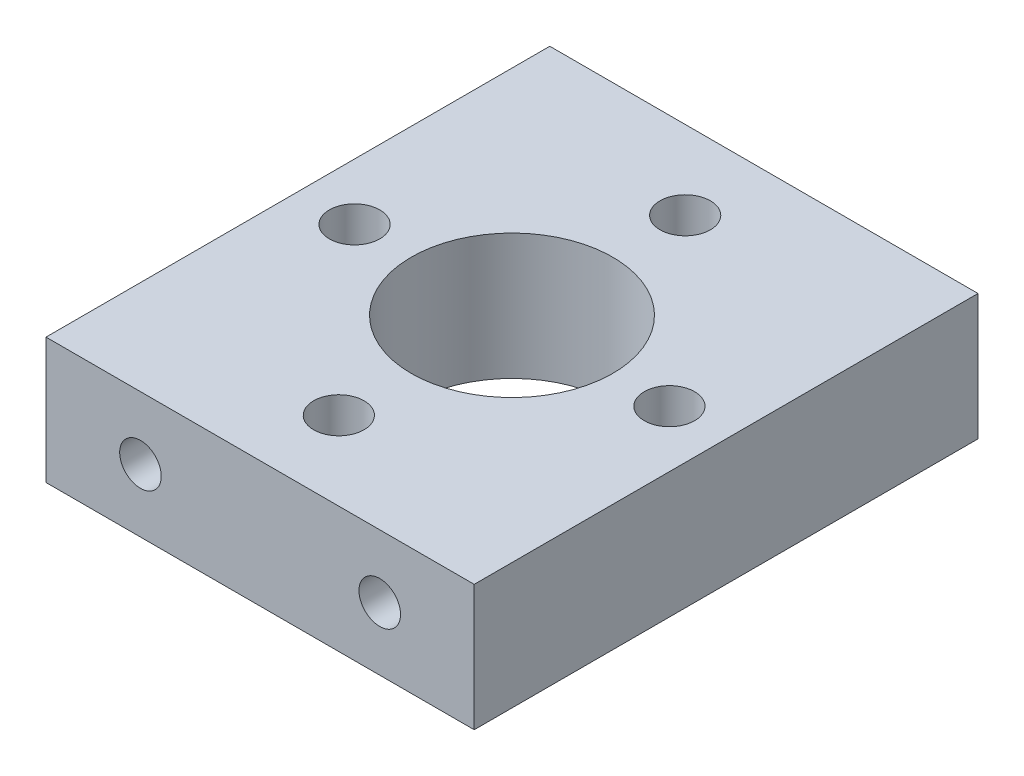
ISO-10303-21;
HEADER;
FILE_DESCRIPTION(('STEP AP214'),'2;1');
FILE_NAME('part.step','',(''),(''),'','','');
FILE_SCHEMA(('AUTOMOTIVE_DESIGN { 1 0 10303 214 1 1 1 1 }'));
ENDSEC;
DATA;
#1=APPLICATION_CONTEXT('core data for automotive mechanical design processes');
#2=APPLICATION_PROTOCOL_DEFINITION('international standard','automotive_design',2000,#1);
#3=PRODUCT_CONTEXT('',#1,'mechanical');
#4=PRODUCT('Part','Part','',(#3));
#5=PRODUCT_RELATED_PRODUCT_CATEGORY('part','',(#4));
#6=PRODUCT_DEFINITION_FORMATION('','',#4);
#7=PRODUCT_DEFINITION_CONTEXT('part definition',#1,'design');
#8=PRODUCT_DEFINITION('design','',#6,#7);
#9=PRODUCT_DEFINITION_SHAPE('','',#8);
#10=(LENGTH_UNIT() NAMED_UNIT(*) SI_UNIT(.MILLI.,.METRE.));
#11=(NAMED_UNIT(*) PLANE_ANGLE_UNIT() SI_UNIT($,.RADIAN.));
#12=(NAMED_UNIT(*) SI_UNIT($,.STERADIAN.) SOLID_ANGLE_UNIT());
#13=UNCERTAINTY_MEASURE_WITH_UNIT(LENGTH_MEASURE(1.E-05),#10,'distance_accuracy_value','');
#14=(GEOMETRIC_REPRESENTATION_CONTEXT(3) GLOBAL_UNCERTAINTY_ASSIGNED_CONTEXT((#13)) GLOBAL_UNIT_ASSIGNED_CONTEXT((#10,
#11,#12)) REPRESENTATION_CONTEXT('',''));
#15=CARTESIAN_POINT('',(0.,0.,0.));
#16=DIRECTION('',(0.,0.,1.));
#17=DIRECTION('',(1.,0.,0.));
#18=AXIS2_PLACEMENT_3D('',#15,#16,#17);
#19=CARTESIAN_POINT('',(0.,10.,0.));
#20=DIRECTION('',(0.,-1.,0.));
#21=DIRECTION('',(0.,0.,-1.));
#22=AXIS2_PLACEMENT_3D('',#19,#20,#21);
#23=PLANE('',#22);
#24=DIRECTION('',(0.,0.,-1.));
#25=VECTOR('',#24,1.);
#26=CARTESIAN_POINT('',(17.,10.,20.));
#27=LINE('',#26,#25);
#28=CARTESIAN_POINT('',(17.,10.,20.));
#29=VERTEX_POINT('',#28);
#30=CARTESIAN_POINT('',(17.,10.,-20.));
#31=VERTEX_POINT('',#30);
#32=EDGE_CURVE('E162',#29,#31,#27,.T.);
#33=ORIENTED_EDGE('',*,*,#32,.T.);
#34=DIRECTION('',(-1.,0.,0.));
#35=VECTOR('',#34,1.);
#36=CARTESIAN_POINT('',(-17.,10.,-20.));
#37=LINE('',#36,#35);
#38=CARTESIAN_POINT('',(-17.,10.,-20.));
#39=VERTEX_POINT('',#38);
#40=EDGE_CURVE('E85',#31,#39,#37,.T.);
#41=ORIENTED_EDGE('',*,*,#40,.T.);
#42=DIRECTION('',(0.,0.,1.));
#43=VECTOR('',#42,1.);
#44=CARTESIAN_POINT('',(-17.,10.,20.));
#45=LINE('',#44,#43);
#46=CARTESIAN_POINT('',(-17.,10.,20.));
#47=VERTEX_POINT('',#46);
#48=EDGE_CURVE('E165',#39,#47,#45,.T.);
#49=ORIENTED_EDGE('',*,*,#48,.T.);
#50=DIRECTION('',(1.,0.,0.));
#51=VECTOR('',#50,1.);
#52=CARTESIAN_POINT('',(-17.,10.,20.));
#53=LINE('',#52,#51);
#54=EDGE_CURVE('E54',#47,#29,#53,.T.);
#55=ORIENTED_EDGE('',*,*,#54,.T.);
#56=EDGE_LOOP('',(#33,#41,#49,#55));
#57=FACE_BOUND('',#56,.T.);
#58=CARTESIAN_POINT('',(0.,10.,0.));
#59=DIRECTION('',(0.,1.,0.));
#60=DIRECTION('',(0.,0.,1.));
#61=AXIS2_PLACEMENT_3D('',#58,#59,#60);
#62=CIRCLE('',#61,8.);
#63=CARTESIAN_POINT('',(0.,10.,8.));
#64=VERTEX_POINT('',#63);
#65=EDGE_CURVE('E156',#64,#64,#62,.T.);
#66=ORIENTED_EDGE('',*,*,#65,.F.);
#67=EDGE_LOOP('',(#66));
#68=FACE_BOUND('',#67,.T.);
#69=CARTESIAN_POINT('',(0.,10.,-13.75));
#70=DIRECTION('',(0.,1.,0.));
#71=DIRECTION('',(0.,0.,1.));
#72=AXIS2_PLACEMENT_3D('',#69,#70,#71);
#73=CIRCLE('',#72,2.);
#74=CARTESIAN_POINT('',(0.,10.,-11.75));
#75=VERTEX_POINT('',#74);
#76=EDGE_CURVE('E150',#75,#75,#73,.T.);
#77=ORIENTED_EDGE('',*,*,#76,.F.);
#78=EDGE_LOOP('',(#77));
#79=FACE_BOUND('',#78,.T.);
#80=CARTESIAN_POINT('',(-12.4999999999996,10.,0.));
#81=DIRECTION('',(0.,1.,0.));
#82=DIRECTION('',(0.,0.,1.));
#83=AXIS2_PLACEMENT_3D('',#80,#81,#82);
#84=CIRCLE('',#83,2.);
#85=CARTESIAN_POINT('',(-12.4999999999996,10.,2.));
#86=VERTEX_POINT('',#85);
#87=EDGE_CURVE('E144',#86,#86,#84,.T.);
#88=ORIENTED_EDGE('',*,*,#87,.F.);
#89=EDGE_LOOP('',(#88));
#90=FACE_BOUND('',#89,.T.);
#91=CARTESIAN_POINT('',(3.79037079500932E-13,10.,13.75));
#92=DIRECTION('',(0.,1.,0.));
#93=DIRECTION('',(0.,0.,1.));
#94=AXIS2_PLACEMENT_3D('',#91,#92,#93);
#95=CIRCLE('',#94,2.);
#96=CARTESIAN_POINT('',(3.79037079500932E-13,10.,15.75));
#97=VERTEX_POINT('',#96);
#98=EDGE_CURVE('E138',#97,#97,#95,.T.);
#99=ORIENTED_EDGE('',*,*,#98,.F.);
#100=EDGE_LOOP('',(#99));
#101=FACE_BOUND('',#100,.T.);
#102=CARTESIAN_POINT('',(12.5000000000004,10.,0.));
#103=DIRECTION('',(0.,1.,0.));
#104=DIRECTION('',(0.,0.,1.));
#105=AXIS2_PLACEMENT_3D('',#102,#103,#104);
#106=CIRCLE('',#105,2.);
#107=CARTESIAN_POINT('',(12.5000000000004,10.,2.));
#108=VERTEX_POINT('',#107);
#109=EDGE_CURVE('E132',#108,#108,#106,.T.);
#110=ORIENTED_EDGE('',*,*,#109,.F.);
#111=EDGE_LOOP('',(#110));
#112=FACE_BOUND('',#111,.T.);
#113=ADVANCED_FACE('F37',(#57,#68,#79,#90,#101,#112),#23,.F.);
#114=CARTESIAN_POINT('',(0.,0.,0.));
#115=DIRECTION('',(0.,-1.,0.));
#116=DIRECTION('',(0.,0.,-1.));
#117=AXIS2_PLACEMENT_3D('',#114,#115,#116);
#118=PLANE('',#117);
#119=CARTESIAN_POINT('',(3.79037079500932E-13,0.,13.75));
#120=DIRECTION('',(0.,1.,0.));
#121=DIRECTION('',(0.,0.,1.));
#122=AXIS2_PLACEMENT_3D('',#119,#120,#121);
#123=CIRCLE('',#122,2.);
#124=CARTESIAN_POINT('',(3.79037079500932E-13,0.,15.75));
#125=VERTEX_POINT('',#124);
#126=EDGE_CURVE('E135',#125,#125,#123,.T.);
#127=ORIENTED_EDGE('',*,*,#126,.T.);
#128=EDGE_LOOP('',(#127));
#129=FACE_BOUND('',#128,.T.);
#130=CARTESIAN_POINT('',(0.,0.,-13.75));
#131=DIRECTION('',(0.,1.,0.));
#132=DIRECTION('',(0.,0.,1.));
#133=AXIS2_PLACEMENT_3D('',#130,#131,#132);
#134=CIRCLE('',#133,2.);
#135=CARTESIAN_POINT('',(0.,0.,-11.75));
#136=VERTEX_POINT('',#135);
#137=EDGE_CURVE('E147',#136,#136,#134,.T.);
#138=ORIENTED_EDGE('',*,*,#137,.T.);
#139=EDGE_LOOP('',(#138));
#140=FACE_BOUND('',#139,.T.);
#141=DIRECTION('',(0.,0.,-1.));
#142=VECTOR('',#141,1.);
#143=CARTESIAN_POINT('',(17.,0.,20.));
#144=LINE('',#143,#142);
#145=CARTESIAN_POINT('',(17.,0.,20.));
#146=VERTEX_POINT('',#145);
#147=CARTESIAN_POINT('',(17.,0.,-20.));
#148=VERTEX_POINT('',#147);
#149=EDGE_CURVE('E159',#146,#148,#144,.T.);
#150=ORIENTED_EDGE('',*,*,#149,.F.);
#151=DIRECTION('',(1.,0.,0.));
#152=VECTOR('',#151,1.);
#153=CARTESIAN_POINT('',(-17.,0.,20.));
#154=LINE('',#153,#152);
#155=CARTESIAN_POINT('',(-17.,0.,20.));
#156=VERTEX_POINT('',#155);
#157=EDGE_CURVE('E78',#156,#146,#154,.T.);
#158=ORIENTED_EDGE('',*,*,#157,.F.);
#159=DIRECTION('',(0.,0.,1.));
#160=VECTOR('',#159,1.);
#161=CARTESIAN_POINT('',(-17.,0.,20.));
#162=LINE('',#161,#160);
#163=CARTESIAN_POINT('',(-17.,0.,-20.));
#164=VERTEX_POINT('',#163);
#165=EDGE_CURVE('E72',#164,#156,#162,.T.);
#166=ORIENTED_EDGE('',*,*,#165,.F.);
#167=DIRECTION('',(-1.,0.,0.));
#168=VECTOR('',#167,1.);
#169=CARTESIAN_POINT('',(-17.,0.,-20.));
#170=LINE('',#169,#168);
#171=EDGE_CURVE('E171',#148,#164,#170,.T.);
#172=ORIENTED_EDGE('',*,*,#171,.F.);
#173=EDGE_LOOP('',(#150,#158,#166,#172));
#174=FACE_BOUND('',#173,.T.);
#175=CARTESIAN_POINT('',(0.,0.,0.));
#176=DIRECTION('',(0.,1.,0.));
#177=DIRECTION('',(0.,0.,1.));
#178=AXIS2_PLACEMENT_3D('',#175,#176,#177);
#179=CIRCLE('',#178,8.);
#180=CARTESIAN_POINT('',(0.,0.,8.));
#181=VERTEX_POINT('',#180);
#182=EDGE_CURVE('E153',#181,#181,#179,.T.);
#183=ORIENTED_EDGE('',*,*,#182,.T.);
#184=EDGE_LOOP('',(#183));
#185=FACE_BOUND('',#184,.T.);
#186=CARTESIAN_POINT('',(-12.4999999999996,0.,0.));
#187=DIRECTION('',(0.,1.,0.));
#188=DIRECTION('',(0.,0.,1.));
#189=AXIS2_PLACEMENT_3D('',#186,#187,#188);
#190=CIRCLE('',#189,2.);
#191=CARTESIAN_POINT('',(-12.4999999999996,0.,2.));
#192=VERTEX_POINT('',#191);
#193=EDGE_CURVE('E141',#192,#192,#190,.T.);
#194=ORIENTED_EDGE('',*,*,#193,.T.);
#195=EDGE_LOOP('',(#194));
#196=FACE_BOUND('',#195,.T.);
#197=CARTESIAN_POINT('',(12.5000000000004,0.,0.));
#198=DIRECTION('',(0.,1.,0.));
#199=DIRECTION('',(0.,0.,1.));
#200=AXIS2_PLACEMENT_3D('',#197,#198,#199);
#201=CIRCLE('',#200,2.);
#202=CARTESIAN_POINT('',(12.5000000000004,0.,2.));
#203=VERTEX_POINT('',#202);
#204=EDGE_CURVE('E131',#203,#203,#201,.T.);
#205=ORIENTED_EDGE('',*,*,#204,.T.);
#206=EDGE_LOOP('',(#205));
#207=FACE_BOUND('',#206,.T.);
#208=ADVANCED_FACE('F181',(#129,#140,#174,#185,#196,#207),#118,.T.);
#209=CARTESIAN_POINT('',(17.,10.,20.));
#210=DIRECTION('',(-1.,0.,0.));
#211=DIRECTION('',(0.,0.,1.));
#212=AXIS2_PLACEMENT_3D('',#209,#210,#211);
#213=PLANE('',#212);
#214=ORIENTED_EDGE('',*,*,#149,.T.);
#215=DIRECTION('',(0.,-1.,0.));
#216=VECTOR('',#215,1.);
#217=CARTESIAN_POINT('',(17.,10.,-20.));
#218=LINE('',#217,#216);
#219=EDGE_CURVE('E11',#31,#148,#218,.T.);
#220=ORIENTED_EDGE('',*,*,#219,.F.);
#221=ORIENTED_EDGE('',*,*,#32,.F.);
#222=DIRECTION('',(0.,-1.,0.));
#223=VECTOR('',#222,1.);
#224=CARTESIAN_POINT('',(17.,10.,20.));
#225=LINE('',#224,#223);
#226=EDGE_CURVE('E168',#29,#146,#225,.T.);
#227=ORIENTED_EDGE('',*,*,#226,.T.);
#228=EDGE_LOOP('',(#214,#220,#221,#227));
#229=FACE_BOUND('',#228,.T.);
#230=ADVANCED_FACE('F39',(#229),#213,.F.);
#231=CARTESIAN_POINT('',(-17.,10.,-20.));
#232=DIRECTION('',(0.,0.,1.));
#233=DIRECTION('',(1.,0.,0.));
#234=AXIS2_PLACEMENT_3D('',#231,#232,#233);
#235=PLANE('',#234);
#236=CARTESIAN_POINT('',(9.5,5.,-20.));
#237=DIRECTION('',(0.,0.,-1.));
#238=DIRECTION('',(-1.,0.,0.));
#239=AXIS2_PLACEMENT_3D('',#236,#237,#238);
#240=CIRCLE('',#239,1.64999999999999);
#241=CARTESIAN_POINT('',(7.85000000000001,5.,-20.));
#242=VERTEX_POINT('',#241);
#243=EDGE_CURVE('E109',#242,#242,#240,.T.);
#244=ORIENTED_EDGE('',*,*,#243,.F.);
#245=EDGE_LOOP('',(#244));
#246=FACE_BOUND('',#245,.T.);
#247=CARTESIAN_POINT('',(-9.50000000000001,5.,-20.));
#248=DIRECTION('',(0.,0.,-1.));
#249=DIRECTION('',(-1.,0.,0.));
#250=AXIS2_PLACEMENT_3D('',#247,#248,#249);
#251=CIRCLE('',#250,1.64999999999999);
#252=CARTESIAN_POINT('',(-11.15,5.,-20.));
#253=VERTEX_POINT('',#252);
#254=EDGE_CURVE('E108',#253,#253,#251,.T.);
#255=ORIENTED_EDGE('',*,*,#254,.F.);
#256=EDGE_LOOP('',(#255));
#257=FACE_BOUND('',#256,.T.);
#258=ORIENTED_EDGE('',*,*,#171,.T.);
#259=DIRECTION('',(0.,-1.,0.));
#260=VECTOR('',#259,1.);
#261=CARTESIAN_POINT('',(-17.,10.,-20.));
#262=LINE('',#261,#260);
#263=EDGE_CURVE('E46',#39,#164,#262,.T.);
#264=ORIENTED_EDGE('',*,*,#263,.F.);
#265=ORIENTED_EDGE('',*,*,#40,.F.);
#266=ORIENTED_EDGE('',*,*,#219,.T.);
#267=EDGE_LOOP('',(#258,#264,#265,#266));
#268=FACE_BOUND('',#267,.T.);
#269=ADVANCED_FACE('F198',(#246,#257,#268),#235,.F.);
#270=CARTESIAN_POINT('',(-17.,10.,20.));
#271=DIRECTION('',(1.,0.,0.));
#272=DIRECTION('',(0.,0.,-1.));
#273=AXIS2_PLACEMENT_3D('',#270,#271,#272);
#274=PLANE('',#273);
#275=ORIENTED_EDGE('',*,*,#165,.T.);
#276=DIRECTION('',(0.,-1.,0.));
#277=VECTOR('',#276,1.);
#278=CARTESIAN_POINT('',(-17.,10.,20.));
#279=LINE('',#278,#277);
#280=EDGE_CURVE('E176',#47,#156,#279,.T.);
#281=ORIENTED_EDGE('',*,*,#280,.F.);
#282=ORIENTED_EDGE('',*,*,#48,.F.);
#283=ORIENTED_EDGE('',*,*,#263,.T.);
#284=EDGE_LOOP('',(#275,#281,#282,#283));
#285=FACE_BOUND('',#284,.T.);
#286=ADVANCED_FACE('F178',(#285),#274,.F.);
#287=CARTESIAN_POINT('',(-17.,10.,20.));
#288=DIRECTION('',(0.,0.,-1.));
#289=DIRECTION('',(-1.,0.,0.));
#290=AXIS2_PLACEMENT_3D('',#287,#288,#289);
#291=PLANE('',#290);
#292=CARTESIAN_POINT('',(-9.50000000000001,5.,20.));
#293=DIRECTION('',(0.,0.,1.));
#294=DIRECTION('',(1.,0.,0.));
#295=AXIS2_PLACEMENT_3D('',#292,#293,#294);
#296=CIRCLE('',#295,1.64999999999999);
#297=CARTESIAN_POINT('',(-7.85000000000001,5.,20.));
#298=VERTEX_POINT('',#297);
#299=EDGE_CURVE('E119',#298,#298,#296,.T.);
#300=ORIENTED_EDGE('',*,*,#299,.F.);
#301=EDGE_LOOP('',(#300));
#302=FACE_BOUND('',#301,.T.);
#303=CARTESIAN_POINT('',(9.5,5.,20.));
#304=DIRECTION('',(0.,0.,1.));
#305=DIRECTION('',(1.,0.,0.));
#306=AXIS2_PLACEMENT_3D('',#303,#304,#305);
#307=CIRCLE('',#306,1.64999999999999);
#308=CARTESIAN_POINT('',(11.15,5.,20.));
#309=VERTEX_POINT('',#308);
#310=EDGE_CURVE('E125',#309,#309,#307,.T.);
#311=ORIENTED_EDGE('',*,*,#310,.F.);
#312=EDGE_LOOP('',(#311));
#313=FACE_BOUND('',#312,.T.);
#314=ORIENTED_EDGE('',*,*,#157,.T.);
#315=ORIENTED_EDGE('',*,*,#226,.F.);
#316=ORIENTED_EDGE('',*,*,#54,.F.);
#317=ORIENTED_EDGE('',*,*,#280,.T.);
#318=EDGE_LOOP('',(#314,#315,#316,#317));
#319=FACE_BOUND('',#318,.T.);
#320=ADVANCED_FACE('F186',(#302,#313,#319),#291,.F.);
#321=CARTESIAN_POINT('',(0.,10.,0.));
#322=DIRECTION('',(0.,-1.,0.));
#323=DIRECTION('',(0.,0.,-1.));
#324=AXIS2_PLACEMENT_3D('',#321,#322,#323);
#325=CYLINDRICAL_SURFACE('',#324,8.);
#326=ORIENTED_EDGE('',*,*,#65,.T.);
#327=EDGE_LOOP('',(#326));
#328=FACE_BOUND('',#327,.T.);
#329=ORIENTED_EDGE('',*,*,#182,.F.);
#330=EDGE_LOOP('',(#329));
#331=FACE_BOUND('',#330,.T.);
#332=ADVANCED_FACE('F188',(#328,#331),#325,.F.);
#333=CARTESIAN_POINT('',(0.,10.,-13.75));
#334=DIRECTION('',(0.,-1.,0.));
#335=DIRECTION('',(0.,0.,-1.));
#336=AXIS2_PLACEMENT_3D('',#333,#334,#335);
#337=CYLINDRICAL_SURFACE('',#336,2.);
#338=ORIENTED_EDGE('',*,*,#76,.T.);
#339=EDGE_LOOP('',(#338));
#340=FACE_BOUND('',#339,.T.);
#341=ORIENTED_EDGE('',*,*,#137,.F.);
#342=EDGE_LOOP('',(#341));
#343=FACE_BOUND('',#342,.T.);
#344=ADVANCED_FACE('F195',(#340,#343),#337,.F.);
#345=CARTESIAN_POINT('',(-12.4999999999996,10.,0.));
#346=DIRECTION('',(0.,-1.,0.));
#347=DIRECTION('',(0.,0.,-1.));
#348=AXIS2_PLACEMENT_3D('',#345,#346,#347);
#349=CYLINDRICAL_SURFACE('',#348,2.);
#350=ORIENTED_EDGE('',*,*,#87,.T.);
#351=EDGE_LOOP('',(#350));
#352=FACE_BOUND('',#351,.T.);
#353=ORIENTED_EDGE('',*,*,#193,.F.);
#354=EDGE_LOOP('',(#353));
#355=FACE_BOUND('',#354,.T.);
#356=ADVANCED_FACE('F213',(#352,#355),#349,.F.);
#357=CARTESIAN_POINT('',(3.79037079500932E-13,10.,13.75));
#358=DIRECTION('',(0.,-1.,0.));
#359=DIRECTION('',(0.,0.,-1.));
#360=AXIS2_PLACEMENT_3D('',#357,#358,#359);
#361=CYLINDRICAL_SURFACE('',#360,2.);
#362=ORIENTED_EDGE('',*,*,#98,.T.);
#363=EDGE_LOOP('',(#362));
#364=FACE_BOUND('',#363,.T.);
#365=ORIENTED_EDGE('',*,*,#126,.F.);
#366=EDGE_LOOP('',(#365));
#367=FACE_BOUND('',#366,.T.);
#368=ADVANCED_FACE('F217',(#364,#367),#361,.F.);
#369=CARTESIAN_POINT('',(12.5000000000004,10.,0.));
#370=DIRECTION('',(0.,-1.,0.));
#371=DIRECTION('',(0.,0.,-1.));
#372=AXIS2_PLACEMENT_3D('',#369,#370,#371);
#373=CYLINDRICAL_SURFACE('',#372,2.);
#374=ORIENTED_EDGE('',*,*,#109,.T.);
#375=EDGE_LOOP('',(#374));
#376=FACE_BOUND('',#375,.T.);
#377=ORIENTED_EDGE('',*,*,#204,.F.);
#378=EDGE_LOOP('',(#377));
#379=FACE_BOUND('',#378,.T.);
#380=ADVANCED_FACE('F221',(#376,#379),#373,.F.);
#381=CARTESIAN_POINT('',(9.5,5.,5.));
#382=DIRECTION('',(0.,0.,1.));
#383=DIRECTION('',(1.,0.,0.));
#384=AXIS2_PLACEMENT_3D('',#381,#382,#383);
#385=CONICAL_SURFACE('',#384,1.65,1.02974425867665);
#386=CARTESIAN_POINT('',(9.49999999999999,5.,4.00857997860452));
#387=VERTEX_POINT('',#386);
#388=VERTEX_LOOP('',#387);
#389=FACE_BOUND('',#388,.T.);
#390=CARTESIAN_POINT('',(9.5,5.,5.));
#391=DIRECTION('',(0.,0.,1.));
#392=DIRECTION('',(1.,0.,0.));
#393=AXIS2_PLACEMENT_3D('',#390,#391,#392);
#394=CIRCLE('',#393,1.65);
#395=CARTESIAN_POINT('',(11.15,5.,5.));
#396=VERTEX_POINT('',#395);
#397=EDGE_CURVE('E128',#396,#396,#394,.T.);
#398=ORIENTED_EDGE('',*,*,#397,.T.);
#399=EDGE_LOOP('',(#398));
#400=FACE_BOUND('',#399,.T.);
#401=ADVANCED_FACE('F225',(#389,#400),#385,.F.);
#402=CARTESIAN_POINT('',(9.5,5.,20.));
#403=DIRECTION('',(0.,0.,1.));
#404=DIRECTION('',(1.,0.,0.));
#405=AXIS2_PLACEMENT_3D('',#402,#403,#404);
#406=CYLINDRICAL_SURFACE('',#405,1.64999999999999);
#407=ORIENTED_EDGE('',*,*,#397,.F.);
#408=EDGE_LOOP('',(#407));
#409=FACE_BOUND('',#408,.T.);
#410=ORIENTED_EDGE('',*,*,#310,.T.);
#411=EDGE_LOOP('',(#410));
#412=FACE_BOUND('',#411,.T.);
#413=ADVANCED_FACE('F229',(#409,#412),#406,.F.);
#414=CARTESIAN_POINT('',(-9.50000000000001,5.,5.));
#415=DIRECTION('',(0.,0.,1.));
#416=DIRECTION('',(1.,0.,0.));
#417=AXIS2_PLACEMENT_3D('',#414,#415,#416);
#418=CONICAL_SURFACE('',#417,1.65,1.02974425867665);
#419=CARTESIAN_POINT('',(-9.50000000000001,5.,4.00857997860452));
#420=VERTEX_POINT('',#419);
#421=VERTEX_LOOP('',#420);
#422=FACE_BOUND('',#421,.T.);
#423=CARTESIAN_POINT('',(-9.50000000000001,5.,5.));
#424=DIRECTION('',(0.,0.,1.));
#425=DIRECTION('',(1.,0.,0.));
#426=AXIS2_PLACEMENT_3D('',#423,#424,#425);
#427=CIRCLE('',#426,1.65);
#428=CARTESIAN_POINT('',(-7.85000000000001,5.,5.));
#429=VERTEX_POINT('',#428);
#430=EDGE_CURVE('E122',#429,#429,#427,.T.);
#431=ORIENTED_EDGE('',*,*,#430,.T.);
#432=EDGE_LOOP('',(#431));
#433=FACE_BOUND('',#432,.T.);
#434=ADVANCED_FACE('F233',(#422,#433),#418,.F.);
#435=CARTESIAN_POINT('',(-9.50000000000001,5.,20.));
#436=DIRECTION('',(0.,0.,1.));
#437=DIRECTION('',(1.,0.,0.));
#438=AXIS2_PLACEMENT_3D('',#435,#436,#437);
#439=CYLINDRICAL_SURFACE('',#438,1.64999999999999);
#440=ORIENTED_EDGE('',*,*,#430,.F.);
#441=EDGE_LOOP('',(#440));
#442=FACE_BOUND('',#441,.T.);
#443=ORIENTED_EDGE('',*,*,#299,.T.);
#444=EDGE_LOOP('',(#443));
#445=FACE_BOUND('',#444,.T.);
#446=ADVANCED_FACE('F237',(#442,#445),#439,.F.);
#447=CARTESIAN_POINT('',(-9.50000000000001,5.,-5.));
#448=DIRECTION('',(0.,0.,-1.));
#449=DIRECTION('',(-1.,0.,0.));
#450=AXIS2_PLACEMENT_3D('',#447,#448,#449);
#451=CONICAL_SURFACE('',#450,1.65,1.02974425867665);
#452=CARTESIAN_POINT('',(-9.50000000000001,5.,-4.00857997860453));
#453=VERTEX_POINT('',#452);
#454=VERTEX_LOOP('',#453);
#455=FACE_BOUND('',#454,.T.);
#456=CARTESIAN_POINT('',(-9.50000000000001,5.,-5.));
#457=DIRECTION('',(0.,0.,-1.));
#458=DIRECTION('',(-1.,0.,0.));
#459=AXIS2_PLACEMENT_3D('',#456,#457,#458);
#460=CIRCLE('',#459,1.65);
#461=CARTESIAN_POINT('',(-11.15,5.,-5.));
#462=VERTEX_POINT('',#461);
#463=EDGE_CURVE('E112',#462,#462,#460,.T.);
#464=ORIENTED_EDGE('',*,*,#463,.T.);
#465=EDGE_LOOP('',(#464));
#466=FACE_BOUND('',#465,.T.);
#467=ADVANCED_FACE('F241',(#455,#466),#451,.F.);
#468=CARTESIAN_POINT('',(-9.50000000000001,5.,-20.));
#469=DIRECTION('',(0.,0.,-1.));
#470=DIRECTION('',(-1.,0.,0.));
#471=AXIS2_PLACEMENT_3D('',#468,#469,#470);
#472=CYLINDRICAL_SURFACE('',#471,1.64999999999999);
#473=ORIENTED_EDGE('',*,*,#463,.F.);
#474=EDGE_LOOP('',(#473));
#475=FACE_BOUND('',#474,.T.);
#476=ORIENTED_EDGE('',*,*,#254,.T.);
#477=EDGE_LOOP('',(#476));
#478=FACE_BOUND('',#477,.T.);
#479=ADVANCED_FACE('F102',(#475,#478),#472,.F.);
#480=CARTESIAN_POINT('',(9.5,5.,-5.));
#481=DIRECTION('',(0.,0.,-1.));
#482=DIRECTION('',(-1.,0.,0.));
#483=AXIS2_PLACEMENT_3D('',#480,#481,#482);
#484=CONICAL_SURFACE('',#483,1.65,1.02974425867665);
#485=CARTESIAN_POINT('',(9.49999999999999,5.,-4.00857997860453));
#486=VERTEX_POINT('',#485);
#487=VERTEX_LOOP('',#486);
#488=FACE_BOUND('',#487,.T.);
#489=CARTESIAN_POINT('',(9.5,5.,-5.));
#490=DIRECTION('',(0.,0.,-1.));
#491=DIRECTION('',(-1.,0.,0.));
#492=AXIS2_PLACEMENT_3D('',#489,#490,#491);
#493=CIRCLE('',#492,1.65);
#494=CARTESIAN_POINT('',(7.85,5.,-5.));
#495=VERTEX_POINT('',#494);
#496=EDGE_CURVE('E106',#495,#495,#493,.T.);
#497=ORIENTED_EDGE('',*,*,#496,.T.);
#498=EDGE_LOOP('',(#497));
#499=FACE_BOUND('',#498,.T.);
#500=ADVANCED_FACE('F98',(#488,#499),#484,.F.);
#501=CARTESIAN_POINT('',(9.5,5.,-20.));
#502=DIRECTION('',(0.,0.,-1.));
#503=DIRECTION('',(-1.,0.,0.));
#504=AXIS2_PLACEMENT_3D('',#501,#502,#503);
#505=CYLINDRICAL_SURFACE('',#504,1.64999999999999);
#506=ORIENTED_EDGE('',*,*,#496,.F.);
#507=EDGE_LOOP('',(#506));
#508=FACE_BOUND('',#507,.T.);
#509=ORIENTED_EDGE('',*,*,#243,.T.);
#510=EDGE_LOOP('',(#509));
#511=FACE_BOUND('',#510,.T.);
#512=ADVANCED_FACE('F101',(#508,#511),#505,.F.);
#513=CLOSED_SHELL('',(#113,#208,#230,#269,#286,#320,#332,#344,#356,#368,#380,#401,#413,#434,
#446,#467,#479,#500,#512));
#514=MANIFOLD_SOLID_BREP('B2',#513);
#515=ADVANCED_BREP_SHAPE_REPRESENTATION('',(#18,#514),#14);
#516=SHAPE_DEFINITION_REPRESENTATION(#9,#515);
ENDSEC;
END-ISO-10303-21;
